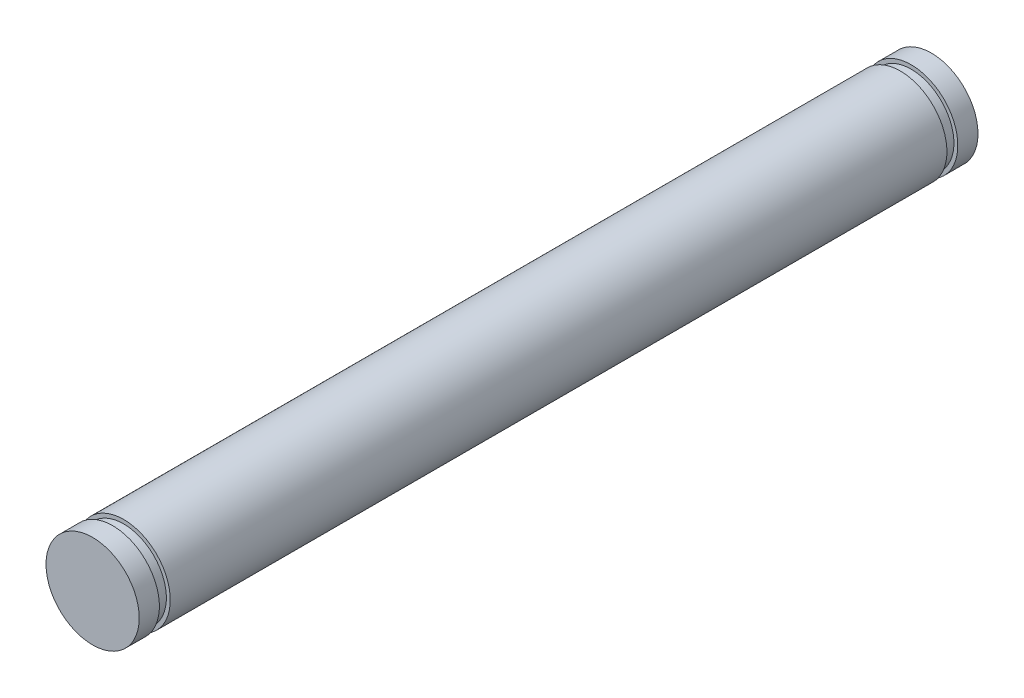
ISO-10303-21;
HEADER;
FILE_DESCRIPTION(('STEP AP214'),'2;1');
FILE_NAME('part.step','',(''),(''),'','','');
FILE_SCHEMA(('AUTOMOTIVE_DESIGN { 1 0 10303 214 1 1 1 1 }'));
ENDSEC;
DATA;
#1=APPLICATION_CONTEXT('core data for automotive mechanical design processes');
#2=APPLICATION_PROTOCOL_DEFINITION('international standard','automotive_design',2000,#1);
#3=PRODUCT_CONTEXT('',#1,'mechanical');
#4=PRODUCT('Part','Part','',(#3));
#5=PRODUCT_RELATED_PRODUCT_CATEGORY('part','',(#4));
#6=PRODUCT_DEFINITION_FORMATION('','',#4);
#7=PRODUCT_DEFINITION_CONTEXT('part definition',#1,'design');
#8=PRODUCT_DEFINITION('design','',#6,#7);
#9=PRODUCT_DEFINITION_SHAPE('','',#8);
#10=(LENGTH_UNIT() NAMED_UNIT(*) SI_UNIT(.MILLI.,.METRE.));
#11=(NAMED_UNIT(*) PLANE_ANGLE_UNIT() SI_UNIT($,.RADIAN.));
#12=(NAMED_UNIT(*) SI_UNIT($,.STERADIAN.) SOLID_ANGLE_UNIT());
#13=UNCERTAINTY_MEASURE_WITH_UNIT(LENGTH_MEASURE(1.E-05),#10,'distance_accuracy_value','');
#14=(GEOMETRIC_REPRESENTATION_CONTEXT(3) GLOBAL_UNCERTAINTY_ASSIGNED_CONTEXT((#13)) GLOBAL_UNIT_ASSIGNED_CONTEXT((#10,
#11,#12)) REPRESENTATION_CONTEXT('',''));
#15=CARTESIAN_POINT('',(0.,0.,0.));
#16=DIRECTION('',(0.,0.,1.));
#17=DIRECTION('',(1.,0.,0.));
#18=AXIS2_PLACEMENT_3D('',#15,#16,#17);
#19=CARTESIAN_POINT('',(0.,0.,54.));
#20=DIRECTION('',(0.,0.,-1.));
#21=DIRECTION('',(-1.,0.,0.));
#22=AXIS2_PLACEMENT_3D('',#19,#20,#21);
#23=CYLINDRICAL_SURFACE('',#22,3.);
#24=CARTESIAN_POINT('',(0.,0.,2.));
#25=DIRECTION('',(0.,0.,-1.));
#26=DIRECTION('',(-1.,0.,0.));
#27=AXIS2_PLACEMENT_3D('',#24,#25,#26);
#28=CIRCLE('',#27,3.);
#29=CARTESIAN_POINT('',(-3.,0.,2.));
#30=VERTEX_POINT('',#29);
#31=EDGE_CURVE('E50',#30,#30,#28,.T.);
#32=ORIENTED_EDGE('',*,*,#31,.F.);
#33=EDGE_LOOP('',(#32));
#34=FACE_BOUND('',#33,.T.);
#35=CARTESIAN_POINT('',(0.,0.,52.));
#36=DIRECTION('',(0.,0.,-1.));
#37=DIRECTION('',(-1.,0.,0.));
#38=AXIS2_PLACEMENT_3D('',#35,#36,#37);
#39=CIRCLE('',#38,3.);
#40=CARTESIAN_POINT('',(-3.,0.,52.));
#41=VERTEX_POINT('',#40);
#42=EDGE_CURVE('E62',#41,#41,#39,.T.);
#43=ORIENTED_EDGE('',*,*,#42,.T.);
#44=EDGE_LOOP('',(#43));
#45=FACE_BOUND('',#44,.T.);
#46=ADVANCED_FACE('F32',(#34,#45),#23,.T.);
#47=CARTESIAN_POINT('',(0.,0.,1.3));
#48=DIRECTION('',(0.,0.,-1.));
#49=DIRECTION('',(-1.,0.,0.));
#50=AXIS2_PLACEMENT_3D('',#47,#48,#49);
#51=CIRCLE('',#50,3.);
#52=CARTESIAN_POINT('',(-3.,0.,1.3));
#53=VERTEX_POINT('',#52);
#54=EDGE_CURVE('E43',#53,#53,#51,.T.);
#55=ORIENTED_EDGE('',*,*,#54,.T.);
#56=EDGE_LOOP('',(#55));
#57=FACE_BOUND('',#56,.T.);
#58=CARTESIAN_POINT('',(0.,0.,0.));
#59=DIRECTION('',(0.,0.,1.));
#60=DIRECTION('',(1.,0.,0.));
#61=AXIS2_PLACEMENT_3D('',#58,#59,#60);
#62=CIRCLE('',#61,3.);
#63=CARTESIAN_POINT('',(3.,0.,0.));
#64=VERTEX_POINT('',#63);
#65=EDGE_CURVE('E36',#64,#64,#62,.T.);
#66=ORIENTED_EDGE('',*,*,#65,.T.);
#67=EDGE_LOOP('',(#66));
#68=FACE_BOUND('',#67,.T.);
#69=ADVANCED_FACE('F34',(#57,#68),#23,.T.);
#70=CARTESIAN_POINT('',(0.,0.,0.));
#71=DIRECTION('',(0.,0.,1.));
#72=DIRECTION('',(1.,0.,0.));
#73=AXIS2_PLACEMENT_3D('',#70,#71,#72);
#74=PLANE('',#73);
#75=ORIENTED_EDGE('',*,*,#65,.F.);
#76=EDGE_LOOP('',(#75));
#77=FACE_BOUND('',#76,.T.);
#78=ADVANCED_FACE('F92',(#77),#74,.F.);
#79=CARTESIAN_POINT('',(0.,0.,1.3));
#80=DIRECTION('',(0.,0.,-1.));
#81=DIRECTION('',(-1.,0.,0.));
#82=AXIS2_PLACEMENT_3D('',#79,#80,#81);
#83=PLANE('',#82);
#84=ORIENTED_EDGE('',*,*,#54,.F.);
#85=EDGE_LOOP('',(#84));
#86=FACE_BOUND('',#85,.T.);
#87=CARTESIAN_POINT('',(0.,0.,1.3));
#88=DIRECTION('',(0.,0.,-1.));
#89=DIRECTION('',(-1.,0.,0.));
#90=AXIS2_PLACEMENT_3D('',#87,#88,#89);
#91=CIRCLE('',#90,2.75);
#92=CARTESIAN_POINT('',(-2.75,0.,1.3));
#93=VERTEX_POINT('',#92);
#94=EDGE_CURVE('E47',#93,#93,#91,.T.);
#95=ORIENTED_EDGE('',*,*,#94,.T.);
#96=EDGE_LOOP('',(#95));
#97=FACE_BOUND('',#96,.T.);
#98=ADVANCED_FACE('F108',(#86,#97),#83,.F.);
#99=CARTESIAN_POINT('',(0.,0.,1.3));
#100=DIRECTION('',(0.,0.,1.));
#101=DIRECTION('',(1.,0.,0.));
#102=AXIS2_PLACEMENT_3D('',#99,#100,#101);
#103=CYLINDRICAL_SURFACE('',#102,2.75);
#104=ORIENTED_EDGE('',*,*,#94,.F.);
#105=EDGE_LOOP('',(#104));
#106=FACE_BOUND('',#105,.T.);
#107=CARTESIAN_POINT('',(0.,0.,2.));
#108=DIRECTION('',(0.,0.,-1.));
#109=DIRECTION('',(-1.,0.,0.));
#110=AXIS2_PLACEMENT_3D('',#107,#108,#109);
#111=CIRCLE('',#110,2.75);
#112=CARTESIAN_POINT('',(-2.75,0.,2.));
#113=VERTEX_POINT('',#112);
#114=EDGE_CURVE('E53',#113,#113,#111,.T.);
#115=ORIENTED_EDGE('',*,*,#114,.T.);
#116=EDGE_LOOP('',(#115));
#117=FACE_BOUND('',#116,.T.);
#118=ADVANCED_FACE('F115',(#106,#117),#103,.T.);
#119=CARTESIAN_POINT('',(0.,0.,2.));
#120=DIRECTION('',(0.,0.,-1.));
#121=DIRECTION('',(-1.,0.,0.));
#122=AXIS2_PLACEMENT_3D('',#119,#120,#121);
#123=PLANE('',#122);
#124=ORIENTED_EDGE('',*,*,#114,.F.);
#125=EDGE_LOOP('',(#124));
#126=FACE_BOUND('',#125,.T.);
#127=ORIENTED_EDGE('',*,*,#31,.T.);
#128=EDGE_LOOP('',(#127));
#129=FACE_BOUND('',#128,.T.);
#130=ADVANCED_FACE('F83',(#126,#129),#123,.T.);
#131=CARTESIAN_POINT('',(0.,0.,52.7));
#132=DIRECTION('',(0.,0.,1.));
#133=DIRECTION('',(-1.,0.,0.));
#134=AXIS2_PLACEMENT_3D('',#131,#132,#133);
#135=PLANE('',#134);
#136=CARTESIAN_POINT('',(0.,0.,52.7));
#137=DIRECTION('',(0.,0.,-1.));
#138=DIRECTION('',(-1.,0.,0.));
#139=AXIS2_PLACEMENT_3D('',#136,#137,#138);
#140=CIRCLE('',#139,2.75);
#141=CARTESIAN_POINT('',(-2.75,0.,52.7));
#142=VERTEX_POINT('',#141);
#143=EDGE_CURVE('E59',#142,#142,#140,.T.);
#144=ORIENTED_EDGE('',*,*,#143,.F.);
#145=EDGE_LOOP('',(#144));
#146=FACE_BOUND('',#145,.T.);
#147=CARTESIAN_POINT('',(0.,0.,52.7));
#148=DIRECTION('',(0.,0.,-1.));
#149=DIRECTION('',(-1.,0.,0.));
#150=AXIS2_PLACEMENT_3D('',#147,#148,#149);
#151=CIRCLE('',#150,3.);
#152=CARTESIAN_POINT('',(-3.,0.,52.7));
#153=VERTEX_POINT('',#152);
#154=EDGE_CURVE('E56',#153,#153,#151,.T.);
#155=ORIENTED_EDGE('',*,*,#154,.T.);
#156=EDGE_LOOP('',(#155));
#157=FACE_BOUND('',#156,.T.);
#158=ADVANCED_FACE('F73',(#146,#157),#135,.F.);
#159=CARTESIAN_POINT('',(0.,0.,52.7));
#160=DIRECTION('',(0.,0.,-1.));
#161=DIRECTION('',(-1.,0.,0.));
#162=AXIS2_PLACEMENT_3D('',#159,#160,#161);
#163=CYLINDRICAL_SURFACE('',#162,2.75);
#164=ORIENTED_EDGE('',*,*,#143,.T.);
#165=EDGE_LOOP('',(#164));
#166=FACE_BOUND('',#165,.T.);
#167=CARTESIAN_POINT('',(0.,0.,52.));
#168=DIRECTION('',(0.,0.,-1.));
#169=DIRECTION('',(-1.,0.,0.));
#170=AXIS2_PLACEMENT_3D('',#167,#168,#169);
#171=CIRCLE('',#170,2.75);
#172=CARTESIAN_POINT('',(-2.75,0.,52.));
#173=VERTEX_POINT('',#172);
#174=EDGE_CURVE('E65',#173,#173,#171,.T.);
#175=ORIENTED_EDGE('',*,*,#174,.F.);
#176=EDGE_LOOP('',(#175));
#177=FACE_BOUND('',#176,.T.);
#178=ADVANCED_FACE('F71',(#166,#177),#163,.T.);
#179=CARTESIAN_POINT('',(0.,0.,52.));
#180=DIRECTION('',(0.,0.,1.));
#181=DIRECTION('',(-1.,0.,0.));
#182=AXIS2_PLACEMENT_3D('',#179,#180,#181);
#183=PLANE('',#182);
#184=ORIENTED_EDGE('',*,*,#42,.F.);
#185=EDGE_LOOP('',(#184));
#186=FACE_BOUND('',#185,.T.);
#187=ORIENTED_EDGE('',*,*,#174,.T.);
#188=EDGE_LOOP('',(#187));
#189=FACE_BOUND('',#188,.T.);
#190=ADVANCED_FACE('F69',(#186,#189),#183,.T.);
#191=CARTESIAN_POINT('',(0.,0.,54.));
#192=DIRECTION('',(0.,0.,1.));
#193=DIRECTION('',(1.,0.,0.));
#194=AXIS2_PLACEMENT_3D('',#191,#192,#193);
#195=PLANE('',#194);
#196=CARTESIAN_POINT('',(0.,0.,54.));
#197=DIRECTION('',(0.,0.,1.));
#198=DIRECTION('',(1.,0.,0.));
#199=AXIS2_PLACEMENT_3D('',#196,#197,#198);
#200=CIRCLE('',#199,3.);
#201=CARTESIAN_POINT('',(3.,0.,54.));
#202=VERTEX_POINT('',#201);
#203=EDGE_CURVE('E10',#202,#202,#200,.T.);
#204=ORIENTED_EDGE('',*,*,#203,.T.);
#205=EDGE_LOOP('',(#204));
#206=FACE_BOUND('',#205,.T.);
#207=ADVANCED_FACE('F80',(#206),#195,.T.);
#208=ORIENTED_EDGE('',*,*,#154,.F.);
#209=EDGE_LOOP('',(#208));
#210=FACE_BOUND('',#209,.T.);
#211=ORIENTED_EDGE('',*,*,#203,.F.);
#212=EDGE_LOOP('',(#211));
#213=FACE_BOUND('',#212,.T.);
#214=ADVANCED_FACE('F88',(#210,#213),#23,.T.);
#215=CLOSED_SHELL('',(#46,#69,#78,#98,#118,#130,#158,#178,#190,#207,#214));
#216=MANIFOLD_SOLID_BREP('B2',#215);
#217=ADVANCED_BREP_SHAPE_REPRESENTATION('',(#18,#216),#14);
#218=SHAPE_DEFINITION_REPRESENTATION(#9,#217);
ENDSEC;
END-ISO-10303-21;
